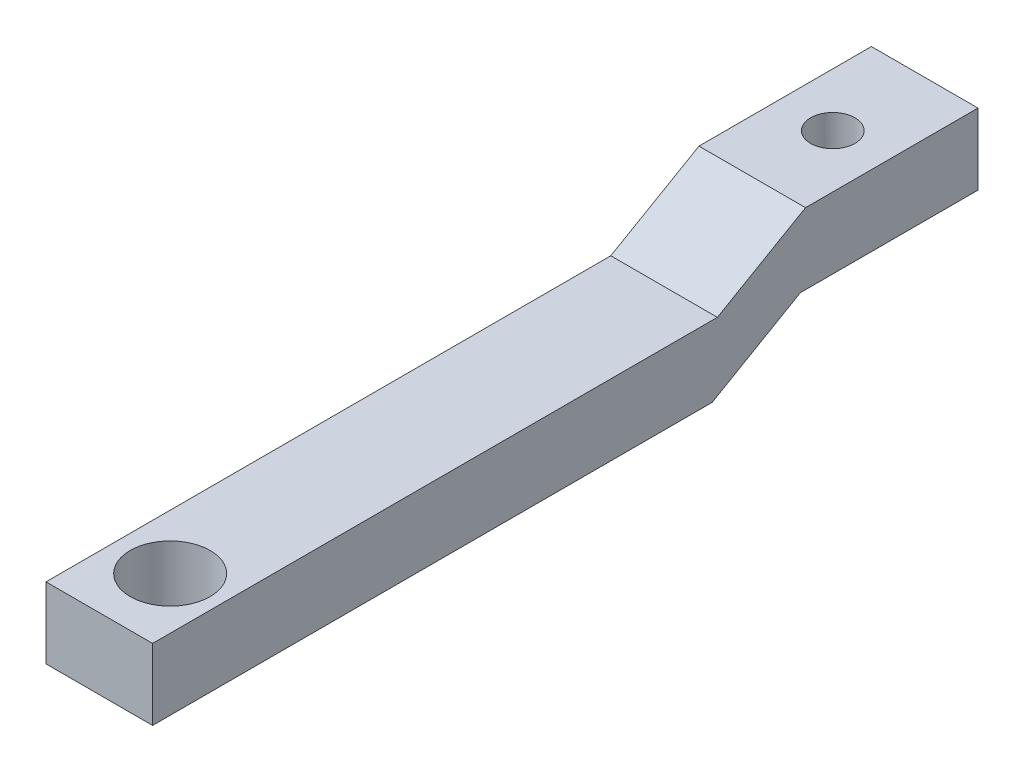
ISO-10303-21;
HEADER;
FILE_DESCRIPTION(('STEP AP214'),'2;1');
FILE_NAME('part.step','',(''),(''),'','','');
FILE_SCHEMA(('AUTOMOTIVE_DESIGN { 1 0 10303 214 1 1 1 1 }'));
ENDSEC;
DATA;
#1=APPLICATION_CONTEXT('core data for automotive mechanical design processes');
#2=APPLICATION_PROTOCOL_DEFINITION('international standard','automotive_design',2000,#1);
#3=PRODUCT_CONTEXT('',#1,'mechanical');
#4=PRODUCT('Part','Part','',(#3));
#5=PRODUCT_RELATED_PRODUCT_CATEGORY('part','',(#4));
#6=PRODUCT_DEFINITION_FORMATION('','',#4);
#7=PRODUCT_DEFINITION_CONTEXT('part definition',#1,'design');
#8=PRODUCT_DEFINITION('design','',#6,#7);
#9=PRODUCT_DEFINITION_SHAPE('','',#8);
#10=(LENGTH_UNIT() NAMED_UNIT(*) SI_UNIT(.MILLI.,.METRE.));
#11=(NAMED_UNIT(*) PLANE_ANGLE_UNIT() SI_UNIT($,.RADIAN.));
#12=(NAMED_UNIT(*) SI_UNIT($,.STERADIAN.) SOLID_ANGLE_UNIT());
#13=UNCERTAINTY_MEASURE_WITH_UNIT(LENGTH_MEASURE(1.E-05),#10,'distance_accuracy_value','');
#14=(GEOMETRIC_REPRESENTATION_CONTEXT(3) GLOBAL_UNCERTAINTY_ASSIGNED_CONTEXT((#13)) GLOBAL_UNIT_ASSIGNED_CONTEXT((#10,
#11,#12)) REPRESENTATION_CONTEXT('',''));
#15=CARTESIAN_POINT('',(0.,0.,0.));
#16=DIRECTION('',(0.,0.,1.));
#17=DIRECTION('',(1.,0.,0.));
#18=AXIS2_PLACEMENT_3D('',#15,#16,#17);
#19=CARTESIAN_POINT('',(-12.,0.,0.));
#20=DIRECTION('',(0.,0.,-1.));
#21=DIRECTION('',(-1.,0.,0.));
#22=AXIS2_PLACEMENT_3D('',#19,#20,#21);
#23=PLANE('',#22);
#24=DIRECTION('',(0.,1.,0.));
#25=VECTOR('',#24,1.);
#26=CARTESIAN_POINT('',(0.,0.,0.));
#27=LINE('',#26,#25);
#28=CARTESIAN_POINT('',(0.,-5.73000000000001,0.));
#29=VERTEX_POINT('',#28);
#30=CARTESIAN_POINT('',(0.,2.26999999999998,0.));
#31=VERTEX_POINT('',#30);
#32=EDGE_CURVE('E130',#29,#31,#27,.T.);
#33=ORIENTED_EDGE('',*,*,#32,.T.);
#34=DIRECTION('',(1.,0.,0.));
#35=VECTOR('',#34,1.);
#36=CARTESIAN_POINT('',(-12.,2.26999999999998,0.));
#37=LINE('',#36,#35);
#38=CARTESIAN_POINT('',(-12.,2.26999999999998,0.));
#39=VERTEX_POINT('',#38);
#40=EDGE_CURVE('E11',#39,#31,#37,.T.);
#41=ORIENTED_EDGE('',*,*,#40,.F.);
#42=DIRECTION('',(0.,1.,0.));
#43=VECTOR('',#42,1.);
#44=CARTESIAN_POINT('',(-12.,0.,0.));
#45=LINE('',#44,#43);
#46=CARTESIAN_POINT('',(-12.,-5.73000000000001,0.));
#47=VERTEX_POINT('',#46);
#48=EDGE_CURVE('E149',#47,#39,#45,.T.);
#49=ORIENTED_EDGE('',*,*,#48,.F.);
#50=DIRECTION('',(1.,0.,0.));
#51=VECTOR('',#50,1.);
#52=CARTESIAN_POINT('',(-12.,-5.73000000000001,0.));
#53=LINE('',#52,#51);
#54=EDGE_CURVE('E38',#47,#29,#53,.T.);
#55=ORIENTED_EDGE('',*,*,#54,.T.);
#56=EDGE_LOOP('',(#33,#41,#49,#55));
#57=FACE_BOUND('',#56,.T.);
#58=ADVANCED_FACE('F35',(#57),#23,.F.);
#59=CARTESIAN_POINT('',(-12.,2.26999999999998,0.));
#60=DIRECTION('',(0.,-1.,0.));
#61=DIRECTION('',(0.,0.,-1.));
#62=AXIS2_PLACEMENT_3D('',#59,#60,#61);
#63=PLANE('',#62);
#64=CARTESIAN_POINT('',(-5.82412022605797,2.26999999999998,-7.8));
#65=DIRECTION('',(0.,-1.,0.));
#66=DIRECTION('',(0.,0.,-1.));
#67=AXIS2_PLACEMENT_3D('',#64,#65,#66);
#68=CIRCLE('',#67,4.5);
#69=CARTESIAN_POINT('',(-5.82412022605797,2.26999999999998,-12.3));
#70=VERTEX_POINT('',#69);
#71=EDGE_CURVE('E134',#70,#70,#68,.F.);
#72=ORIENTED_EDGE('',*,*,#71,.F.);
#73=EDGE_LOOP('',(#72));
#74=FACE_BOUND('',#73,.T.);
#75=DIRECTION('',(0.,0.,-1.));
#76=VECTOR('',#75,1.);
#77=CARTESIAN_POINT('',(0.,2.26999999999998,0.));
#78=LINE('',#77,#76);
#79=CARTESIAN_POINT('',(0.,2.26999999999998,-63.5799172470055));
#80=VERTEX_POINT('',#79);
#81=EDGE_CURVE('E86',#31,#80,#78,.T.);
#82=ORIENTED_EDGE('',*,*,#81,.T.);
#83=DIRECTION('',(1.,0.,0.));
#84=VECTOR('',#83,1.);
#85=CARTESIAN_POINT('',(-12.,2.26999999999998,-63.5799172470055));
#86=LINE('',#85,#84);
#87=CARTESIAN_POINT('',(-12.,2.26999999999998,-63.5799172470055));
#88=VERTEX_POINT('',#87);
#89=EDGE_CURVE('E44',#88,#80,#86,.T.);
#90=ORIENTED_EDGE('',*,*,#89,.F.);
#91=DIRECTION('',(0.,0.,-1.));
#92=VECTOR('',#91,1.);
#93=CARTESIAN_POINT('',(-12.,2.26999999999998,0.));
#94=LINE('',#93,#92);
#95=EDGE_CURVE('E52',#39,#88,#94,.T.);
#96=ORIENTED_EDGE('',*,*,#95,.F.);
#97=ORIENTED_EDGE('',*,*,#40,.T.);
#98=EDGE_LOOP('',(#82,#90,#96,#97));
#99=FACE_BOUND('',#98,.T.);
#100=ADVANCED_FACE('F177',(#74,#99),#63,.F.);
#101=CARTESIAN_POINT('',(-12.,-25.8284117532094,-14.9120404784557));
#102=DIRECTION('',(0.,0.866025403784441,0.499999999999995));
#103=DIRECTION('',(0.,-0.499999999999995,0.866025403784442));
#104=AXIS2_PLACEMENT_3D('',#101,#102,#103);
#105=PLANE('',#104);
#106=DIRECTION('',(0.,-0.499999999999995,0.866025403784442));
#107=VECTOR('',#106,1.);
#108=CARTESIAN_POINT('',(0.,-25.8284117532094,-14.9120404784557));
#109=LINE('',#108,#107);
#110=CARTESIAN_POINT('',(0.,8.,-73.5045683743754));
#111=VERTEX_POINT('',#110);
#112=EDGE_CURVE('E111',#111,#80,#109,.T.);
#113=ORIENTED_EDGE('',*,*,#112,.F.);
#114=DIRECTION('',(1.,0.,0.));
#115=VECTOR('',#114,1.);
#116=CARTESIAN_POINT('',(-12.,8.,-73.5045683743754));
#117=LINE('',#116,#115);
#118=CARTESIAN_POINT('',(-12.,8.,-73.5045683743754));
#119=VERTEX_POINT('',#118);
#120=EDGE_CURVE('E106',#119,#111,#117,.T.);
#121=ORIENTED_EDGE('',*,*,#120,.F.);
#122=DIRECTION('',(0.,-0.499999999999995,0.866025403784442));
#123=VECTOR('',#122,1.);
#124=CARTESIAN_POINT('',(-12.,-25.8284117532094,-14.9120404784557));
#125=LINE('',#124,#123);
#126=EDGE_CURVE('E110',#119,#88,#125,.T.);
#127=ORIENTED_EDGE('',*,*,#126,.T.);
#128=ORIENTED_EDGE('',*,*,#89,.T.);
#129=EDGE_LOOP('',(#113,#121,#127,#128));
#130=FACE_BOUND('',#129,.T.);
#131=ADVANCED_FACE('F108',(#130),#105,.T.);
#132=CARTESIAN_POINT('',(-12.,8.,0.));
#133=DIRECTION('',(0.,-1.,0.));
#134=DIRECTION('',(0.,0.,-1.));
#135=AXIS2_PLACEMENT_3D('',#132,#133,#134);
#136=PLANE('',#135);
#137=CARTESIAN_POINT('',(-5.97857296331822,8.,-82.5500221368559));
#138=DIRECTION('',(0.,1.,0.));
#139=DIRECTION('',(0.,0.,1.));
#140=AXIS2_PLACEMENT_3D('',#137,#138,#139);
#141=CIRCLE('',#140,2.5);
#142=CARTESIAN_POINT('',(-5.97857296331822,8.,-80.0500221368559));
#143=VERTEX_POINT('',#142);
#144=EDGE_CURVE('E219',#143,#143,#141,.T.);
#145=ORIENTED_EDGE('',*,*,#144,.F.);
#146=EDGE_LOOP('',(#145));
#147=FACE_BOUND('',#146,.T.);
#148=DIRECTION('',(0.,0.,-1.));
#149=VECTOR('',#148,1.);
#150=CARTESIAN_POINT('',(0.,8.,0.));
#151=LINE('',#150,#149);
#152=CARTESIAN_POINT('',(0.,8.,-92.92));
#153=VERTEX_POINT('',#152);
#154=EDGE_CURVE('E146',#111,#153,#151,.T.);
#155=ORIENTED_EDGE('',*,*,#154,.T.);
#156=DIRECTION('',(1.,0.,0.));
#157=VECTOR('',#156,1.);
#158=CARTESIAN_POINT('',(-12.,8.,-92.92));
#159=LINE('',#158,#157);
#160=CARTESIAN_POINT('',(-12.,8.,-92.92));
#161=VERTEX_POINT('',#160);
#162=EDGE_CURVE('E115',#161,#153,#159,.T.);
#163=ORIENTED_EDGE('',*,*,#162,.F.);
#164=DIRECTION('',(0.,0.,-1.));
#165=VECTOR('',#164,1.);
#166=CARTESIAN_POINT('',(-12.,8.,0.));
#167=LINE('',#166,#165);
#168=EDGE_CURVE('E118',#119,#161,#167,.T.);
#169=ORIENTED_EDGE('',*,*,#168,.F.);
#170=ORIENTED_EDGE('',*,*,#120,.T.);
#171=EDGE_LOOP('',(#155,#163,#169,#170));
#172=FACE_BOUND('',#171,.T.);
#173=ADVANCED_FACE('F119',(#147,#172),#136,.F.);
#174=CARTESIAN_POINT('',(-12.,0.,-92.92));
#175=DIRECTION('',(0.,0.,-1.));
#176=DIRECTION('',(-1.,0.,0.));
#177=AXIS2_PLACEMENT_3D('',#174,#175,#176);
#178=PLANE('',#177);
#179=DIRECTION('',(0.,1.,0.));
#180=VECTOR('',#179,1.);
#181=CARTESIAN_POINT('',(0.,0.,-92.92));
#182=LINE('',#181,#180);
#183=CARTESIAN_POINT('',(0.,0.,-92.92));
#184=VERTEX_POINT('',#183);
#185=EDGE_CURVE('E143',#184,#153,#182,.T.);
#186=ORIENTED_EDGE('',*,*,#185,.F.);
#187=DIRECTION('',(1.,0.,0.));
#188=VECTOR('',#187,1.);
#189=CARTESIAN_POINT('',(-12.,0.,-92.92));
#190=LINE('',#189,#188);
#191=CARTESIAN_POINT('',(-12.,0.,-92.92));
#192=VERTEX_POINT('',#191);
#193=EDGE_CURVE('E153',#192,#184,#190,.T.);
#194=ORIENTED_EDGE('',*,*,#193,.F.);
#195=DIRECTION('',(0.,1.,0.));
#196=VECTOR('',#195,1.);
#197=CARTESIAN_POINT('',(-12.,0.,-92.92));
#198=LINE('',#197,#196);
#199=EDGE_CURVE('E123',#192,#161,#198,.T.);
#200=ORIENTED_EDGE('',*,*,#199,.T.);
#201=ORIENTED_EDGE('',*,*,#162,.T.);
#202=EDGE_LOOP('',(#186,#194,#200,#201));
#203=FACE_BOUND('',#202,.T.);
#204=ADVANCED_FACE('F192',(#203),#178,.T.);
#205=CARTESIAN_POINT('',(-12.,0.,0.));
#206=DIRECTION('',(0.,-1.,0.));
#207=DIRECTION('',(0.,0.,-1.));
#208=AXIS2_PLACEMENT_3D('',#205,#206,#207);
#209=PLANE('',#208);
#210=CARTESIAN_POINT('',(-5.97857296331822,0.,-82.5500221368559));
#211=DIRECTION('',(0.,-1.,0.));
#212=DIRECTION('',(0.,0.,-1.));
#213=AXIS2_PLACEMENT_3D('',#210,#211,#212);
#214=CIRCLE('',#213,2.5);
#215=CARTESIAN_POINT('',(-5.97857296331822,0.,-85.0500221368559));
#216=VERTEX_POINT('',#215);
#217=EDGE_CURVE('E204',#216,#216,#214,.F.);
#218=ORIENTED_EDGE('',*,*,#217,.T.);
#219=EDGE_LOOP('',(#218));
#220=FACE_BOUND('',#219,.T.);
#221=DIRECTION('',(0.,0.,-1.));
#222=VECTOR('',#221,1.);
#223=CARTESIAN_POINT('',(0.,0.,0.));
#224=LINE('',#223,#222);
#225=CARTESIAN_POINT('',(0.,0.,-72.92));
#226=VERTEX_POINT('',#225);
#227=EDGE_CURVE('E140',#226,#184,#224,.T.);
#228=ORIENTED_EDGE('',*,*,#227,.F.);
#229=DIRECTION('',(1.,0.,0.));
#230=VECTOR('',#229,1.);
#231=CARTESIAN_POINT('',(-12.,0.,-72.92));
#232=LINE('',#231,#230);
#233=CARTESIAN_POINT('',(-12.,0.,-72.92));
#234=VERTEX_POINT('',#233);
#235=EDGE_CURVE('E155',#234,#226,#232,.T.);
#236=ORIENTED_EDGE('',*,*,#235,.F.);
#237=DIRECTION('',(0.,0.,-1.));
#238=VECTOR('',#237,1.);
#239=CARTESIAN_POINT('',(-12.,0.,0.));
#240=LINE('',#239,#238);
#241=EDGE_CURVE('E211',#234,#192,#240,.T.);
#242=ORIENTED_EDGE('',*,*,#241,.T.);
#243=ORIENTED_EDGE('',*,*,#193,.T.);
#244=EDGE_LOOP('',(#228,#236,#242,#243));
#245=FACE_BOUND('',#244,.T.);
#246=ADVANCED_FACE('F172',(#220,#245),#209,.T.);
#247=CARTESIAN_POINT('',(-12.,-31.5752862219807,-18.2300000000001));
#248=DIRECTION('',(0.,0.866025403784438,0.500000000000001));
#249=DIRECTION('',(0.,-0.500000000000001,0.866025403784438));
#250=AXIS2_PLACEMENT_3D('',#247,#248,#249);
#251=PLANE('',#250);
#252=DIRECTION('',(0.,-0.500000000000001,0.866025403784438));
#253=VECTOR('',#252,1.);
#254=CARTESIAN_POINT('',(0.,-31.5752862219807,-18.2300000000001));
#255=LINE('',#254,#253);
#256=CARTESIAN_POINT('',(0.,-5.73000000000001,-62.9953488726304));
#257=VERTEX_POINT('',#256);
#258=EDGE_CURVE('E137',#226,#257,#255,.T.);
#259=ORIENTED_EDGE('',*,*,#258,.T.);
#260=DIRECTION('',(1.,0.,0.));
#261=VECTOR('',#260,1.);
#262=CARTESIAN_POINT('',(-12.,-5.73000000000001,-62.9953488726304));
#263=LINE('',#262,#261);
#264=CARTESIAN_POINT('',(-12.,-5.73000000000001,-62.9953488726304));
#265=VERTEX_POINT('',#264);
#266=EDGE_CURVE('E156',#265,#257,#263,.T.);
#267=ORIENTED_EDGE('',*,*,#266,.F.);
#268=DIRECTION('',(0.,-0.500000000000001,0.866025403784438));
#269=VECTOR('',#268,1.);
#270=CARTESIAN_POINT('',(-12.,-31.5752862219807,-18.2300000000001));
#271=LINE('',#270,#269);
#272=EDGE_CURVE('E209',#234,#265,#271,.T.);
#273=ORIENTED_EDGE('',*,*,#272,.F.);
#274=ORIENTED_EDGE('',*,*,#235,.T.);
#275=EDGE_LOOP('',(#259,#267,#273,#274));
#276=FACE_BOUND('',#275,.T.);
#277=ADVANCED_FACE('F165',(#276),#251,.F.);
#278=CARTESIAN_POINT('',(-12.,-5.73000000000001,0.));
#279=DIRECTION('',(0.,-1.,0.));
#280=DIRECTION('',(0.,0.,-1.));
#281=AXIS2_PLACEMENT_3D('',#278,#279,#280);
#282=PLANE('',#281);
#283=CARTESIAN_POINT('',(-5.82412022605797,-5.73000000000001,-7.8));
#284=DIRECTION('',(0.,-1.,0.));
#285=DIRECTION('',(0.,0.,-1.));
#286=AXIS2_PLACEMENT_3D('',#283,#284,#285);
#287=CIRCLE('',#286,4.5);
#288=CARTESIAN_POINT('',(-5.82412022605797,-5.73000000000001,-12.3));
#289=VERTEX_POINT('',#288);
#290=EDGE_CURVE('E222',#289,#289,#287,.F.);
#291=ORIENTED_EDGE('',*,*,#290,.T.);
#292=EDGE_LOOP('',(#291));
#293=FACE_BOUND('',#292,.T.);
#294=DIRECTION('',(0.,0.,-1.));
#295=VECTOR('',#294,1.);
#296=CARTESIAN_POINT('',(0.,-5.73000000000001,0.));
#297=LINE('',#296,#295);
#298=EDGE_CURVE('E133',#29,#257,#297,.T.);
#299=ORIENTED_EDGE('',*,*,#298,.F.);
#300=ORIENTED_EDGE('',*,*,#54,.F.);
#301=DIRECTION('',(0.,0.,-1.));
#302=VECTOR('',#301,1.);
#303=CARTESIAN_POINT('',(-12.,-5.73000000000001,0.));
#304=LINE('',#303,#302);
#305=EDGE_CURVE('E212',#47,#265,#304,.T.);
#306=ORIENTED_EDGE('',*,*,#305,.T.);
#307=ORIENTED_EDGE('',*,*,#266,.T.);
#308=EDGE_LOOP('',(#299,#300,#306,#307));
#309=FACE_BOUND('',#308,.T.);
#310=ADVANCED_FACE('F163',(#293,#309),#282,.T.);
#311=CARTESIAN_POINT('',(-12.,0.,0.));
#312=DIRECTION('',(1.,0.,0.));
#313=DIRECTION('',(0.,0.,-1.));
#314=AXIS2_PLACEMENT_3D('',#311,#312,#313);
#315=PLANE('',#314);
#316=ORIENTED_EDGE('',*,*,#48,.T.);
#317=ORIENTED_EDGE('',*,*,#95,.T.);
#318=ORIENTED_EDGE('',*,*,#126,.F.);
#319=ORIENTED_EDGE('',*,*,#168,.T.);
#320=ORIENTED_EDGE('',*,*,#199,.F.);
#321=ORIENTED_EDGE('',*,*,#241,.F.);
#322=ORIENTED_EDGE('',*,*,#272,.T.);
#323=ORIENTED_EDGE('',*,*,#305,.F.);
#324=EDGE_LOOP('',(#316,#317,#318,#319,#320,#321,#322,#323));
#325=FACE_BOUND('',#324,.T.);
#326=ADVANCED_FACE('F125',(#325),#315,.F.);
#327=CARTESIAN_POINT('',(0.,0.,0.));
#328=DIRECTION('',(1.,0.,0.));
#329=DIRECTION('',(0.,0.,-1.));
#330=AXIS2_PLACEMENT_3D('',#327,#328,#329);
#331=PLANE('',#330);
#332=ORIENTED_EDGE('',*,*,#32,.F.);
#333=ORIENTED_EDGE('',*,*,#298,.T.);
#334=ORIENTED_EDGE('',*,*,#258,.F.);
#335=ORIENTED_EDGE('',*,*,#227,.T.);
#336=ORIENTED_EDGE('',*,*,#185,.T.);
#337=ORIENTED_EDGE('',*,*,#154,.F.);
#338=ORIENTED_EDGE('',*,*,#112,.T.);
#339=ORIENTED_EDGE('',*,*,#81,.F.);
#340=EDGE_LOOP('',(#332,#333,#334,#335,#336,#337,#338,#339));
#341=FACE_BOUND('',#340,.T.);
#342=ADVANCED_FACE('F161',(#341),#331,.T.);
#343=CARTESIAN_POINT('',(-5.82412022605797,-5.73100000000001,-7.8));
#344=DIRECTION('',(0.,1.,0.));
#345=DIRECTION('',(0.,0.,1.));
#346=AXIS2_PLACEMENT_3D('',#343,#344,#345);
#347=CYLINDRICAL_SURFACE('',#346,4.5);
#348=ORIENTED_EDGE('',*,*,#290,.F.);
#349=EDGE_LOOP('',(#348));
#350=FACE_BOUND('',#349,.T.);
#351=ORIENTED_EDGE('',*,*,#71,.T.);
#352=EDGE_LOOP('',(#351));
#353=FACE_BOUND('',#352,.T.);
#354=ADVANCED_FACE('F227',(#350,#353),#347,.F.);
#355=CARTESIAN_POINT('',(-5.97857296331822,-5.73100000000001,-82.5500221368559));
#356=DIRECTION('',(0.,1.,0.));
#357=DIRECTION('',(0.,0.,1.));
#358=AXIS2_PLACEMENT_3D('',#355,#356,#357);
#359=CYLINDRICAL_SURFACE('',#358,2.5);
#360=ORIENTED_EDGE('',*,*,#217,.F.);
#361=EDGE_LOOP('',(#360));
#362=FACE_BOUND('',#361,.T.);
#363=ORIENTED_EDGE('',*,*,#144,.T.);
#364=EDGE_LOOP('',(#363));
#365=FACE_BOUND('',#364,.T.);
#366=ADVANCED_FACE('F230',(#362,#365),#359,.F.);
#367=CLOSED_SHELL('',(#58,#100,#131,#173,#204,#246,#277,#310,#326,#342,#354,#366));
#368=MANIFOLD_SOLID_BREP('B2',#367);
#369=ADVANCED_BREP_SHAPE_REPRESENTATION('',(#18,#368),#14);
#370=SHAPE_DEFINITION_REPRESENTATION(#9,#369);
ENDSEC;
END-ISO-10303-21;
